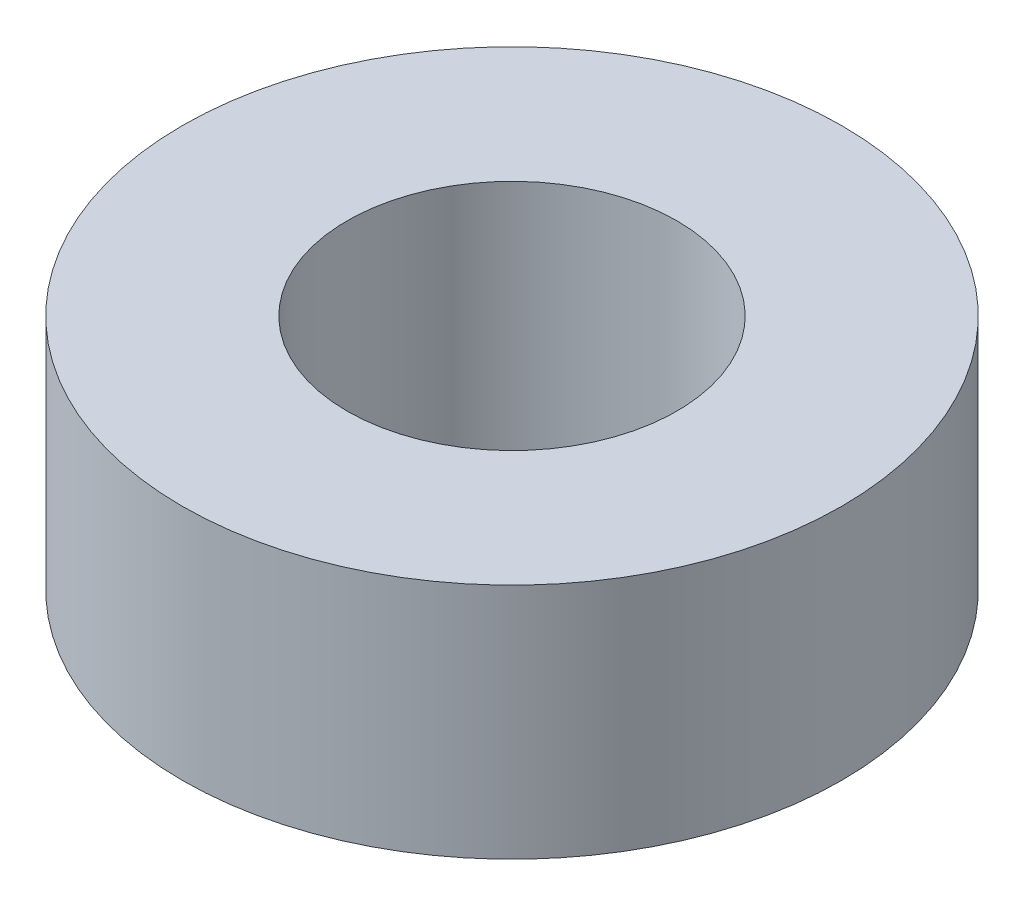
ISO-10303-21;
HEADER;
FILE_DESCRIPTION(('STEP AP214'),'2;1');
FILE_NAME('part.step','',(''),(''),'','','');
FILE_SCHEMA(('AUTOMOTIVE_DESIGN { 1 0 10303 214 1 1 1 1 }'));
ENDSEC;
DATA;
#1=APPLICATION_CONTEXT('core data for automotive mechanical design processes');
#2=APPLICATION_PROTOCOL_DEFINITION('international standard','automotive_design',2000,#1);
#3=PRODUCT_CONTEXT('',#1,'mechanical');
#4=PRODUCT('Part','Part','',(#3));
#5=PRODUCT_RELATED_PRODUCT_CATEGORY('part','',(#4));
#6=PRODUCT_DEFINITION_FORMATION('','',#4);
#7=PRODUCT_DEFINITION_CONTEXT('part definition',#1,'design');
#8=PRODUCT_DEFINITION('design','',#6,#7);
#9=PRODUCT_DEFINITION_SHAPE('','',#8);
#10=(LENGTH_UNIT() NAMED_UNIT(*) SI_UNIT(.MILLI.,.METRE.));
#11=(NAMED_UNIT(*) PLANE_ANGLE_UNIT() SI_UNIT($,.RADIAN.));
#12=(NAMED_UNIT(*) SI_UNIT($,.STERADIAN.) SOLID_ANGLE_UNIT());
#13=UNCERTAINTY_MEASURE_WITH_UNIT(LENGTH_MEASURE(1.E-05),#10,'distance_accuracy_value','');
#14=(GEOMETRIC_REPRESENTATION_CONTEXT(3) GLOBAL_UNCERTAINTY_ASSIGNED_CONTEXT((#13)) GLOBAL_UNIT_ASSIGNED_CONTEXT((#10,
#11,#12)) REPRESENTATION_CONTEXT('',''));
#15=CARTESIAN_POINT('',(0.,0.,0.));
#16=DIRECTION('',(0.,0.,1.));
#17=DIRECTION('',(1.,0.,0.));
#18=AXIS2_PLACEMENT_3D('',#15,#16,#17);
#19=CARTESIAN_POINT('',(0.,589.788,0.));
#20=DIRECTION('',(0.,1.,0.));
#21=DIRECTION('',(0.,0.,1.));
#22=AXIS2_PLACEMENT_3D('',#19,#20,#21);
#23=PLANE('',#22);
#24=CARTESIAN_POINT('',(0.,589.788,0.));
#25=DIRECTION('',(0.,1.,0.));
#26=DIRECTION('',(0.,0.,1.));
#27=AXIS2_PLACEMENT_3D('',#24,#25,#26);
#28=CIRCLE('',#27,819.15);
#29=CARTESIAN_POINT('',(0.,589.788,819.15));
#30=VERTEX_POINT('',#29);
#31=EDGE_CURVE('E11',#30,#30,#28,.T.);
#32=ORIENTED_EDGE('',*,*,#31,.T.);
#33=EDGE_LOOP('',(#32));
#34=FACE_BOUND('',#33,.T.);
#35=CARTESIAN_POINT('',(0.,589.788,0.));
#36=DIRECTION('',(0.,1.,0.));
#37=DIRECTION('',(0.,0.,1.));
#38=AXIS2_PLACEMENT_3D('',#35,#36,#37);
#39=CIRCLE('',#38,409.702);
#40=CARTESIAN_POINT('',(0.,589.788,409.702));
#41=VERTEX_POINT('',#40);
#42=EDGE_CURVE('E50',#41,#41,#39,.T.);
#43=ORIENTED_EDGE('',*,*,#42,.F.);
#44=EDGE_LOOP('',(#43));
#45=FACE_BOUND('',#44,.T.);
#46=ADVANCED_FACE('F39',(#34,#45),#23,.T.);
#47=CARTESIAN_POINT('',(0.,0.,0.));
#48=DIRECTION('',(0.,1.,0.));
#49=DIRECTION('',(0.,0.,1.));
#50=AXIS2_PLACEMENT_3D('',#47,#48,#49);
#51=PLANE('',#50);
#52=CARTESIAN_POINT('',(0.,0.,0.));
#53=DIRECTION('',(0.,1.,0.));
#54=DIRECTION('',(0.,0.,1.));
#55=AXIS2_PLACEMENT_3D('',#52,#53,#54);
#56=CIRCLE('',#55,819.15);
#57=CARTESIAN_POINT('',(0.,0.,819.15));
#58=VERTEX_POINT('',#57);
#59=EDGE_CURVE('E43',#58,#58,#56,.T.);
#60=ORIENTED_EDGE('',*,*,#59,.F.);
#61=EDGE_LOOP('',(#60));
#62=FACE_BOUND('',#61,.T.);
#63=CARTESIAN_POINT('',(0.,0.,0.));
#64=DIRECTION('',(0.,1.,0.));
#65=DIRECTION('',(0.,0.,1.));
#66=AXIS2_PLACEMENT_3D('',#63,#64,#65);
#67=CIRCLE('',#66,409.702);
#68=CARTESIAN_POINT('',(0.,0.,409.702));
#69=VERTEX_POINT('',#68);
#70=EDGE_CURVE('E52',#69,#69,#67,.T.);
#71=ORIENTED_EDGE('',*,*,#70,.T.);
#72=EDGE_LOOP('',(#71));
#73=FACE_BOUND('',#72,.T.);
#74=ADVANCED_FACE('F62',(#62,#73),#51,.F.);
#75=CARTESIAN_POINT('',(0.,589.788,0.));
#76=DIRECTION('',(0.,-1.,0.));
#77=DIRECTION('',(0.,0.,-1.));
#78=AXIS2_PLACEMENT_3D('',#75,#76,#77);
#79=CYLINDRICAL_SURFACE('',#78,819.15);
#80=ORIENTED_EDGE('',*,*,#31,.F.);
#81=EDGE_LOOP('',(#80));
#82=FACE_BOUND('',#81,.T.);
#83=ORIENTED_EDGE('',*,*,#59,.T.);
#84=EDGE_LOOP('',(#83));
#85=FACE_BOUND('',#84,.T.);
#86=ADVANCED_FACE('F41',(#82,#85),#79,.T.);
#87=CARTESIAN_POINT('',(0.,589.788,0.));
#88=DIRECTION('',(0.,-1.,0.));
#89=DIRECTION('',(0.,0.,-1.));
#90=AXIS2_PLACEMENT_3D('',#87,#88,#89);
#91=CYLINDRICAL_SURFACE('',#90,409.702);
#92=ORIENTED_EDGE('',*,*,#42,.T.);
#93=EDGE_LOOP('',(#92));
#94=FACE_BOUND('',#93,.T.);
#95=ORIENTED_EDGE('',*,*,#70,.F.);
#96=EDGE_LOOP('',(#95));
#97=FACE_BOUND('',#96,.T.);
#98=ADVANCED_FACE('F58',(#94,#97),#91,.F.);
#99=CLOSED_SHELL('',(#46,#74,#86,#98));
#100=MANIFOLD_SOLID_BREP('B2',#99);
#101=ADVANCED_BREP_SHAPE_REPRESENTATION('',(#18,#100),#14);
#102=SHAPE_DEFINITION_REPRESENTATION(#9,#101);
ENDSEC;
END-ISO-10303-21;
